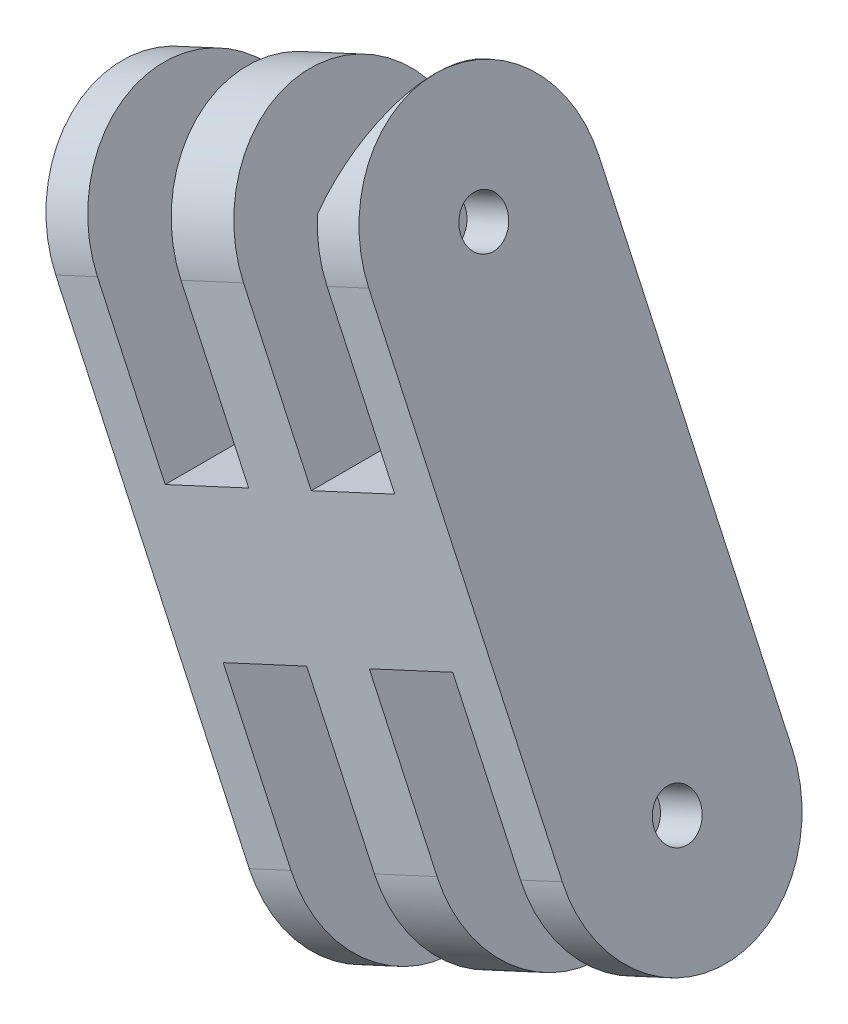
ISO-10303-21;
HEADER;
FILE_DESCRIPTION(('STEP AP214'),'2;1');
FILE_NAME('part.step','',(''),(''),'','','');
FILE_SCHEMA(('AUTOMOTIVE_DESIGN { 1 0 10303 214 1 1 1 1 }'));
ENDSEC;
DATA;
#1=APPLICATION_CONTEXT('core data for automotive mechanical design processes');
#2=APPLICATION_PROTOCOL_DEFINITION('international standard','automotive_design',2000,#1);
#3=PRODUCT_CONTEXT('',#1,'mechanical');
#4=PRODUCT('Part','Part','',(#3));
#5=PRODUCT_RELATED_PRODUCT_CATEGORY('part','',(#4));
#6=PRODUCT_DEFINITION_FORMATION('','',#4);
#7=PRODUCT_DEFINITION_CONTEXT('part definition',#1,'design');
#8=PRODUCT_DEFINITION('design','',#6,#7);
#9=PRODUCT_DEFINITION_SHAPE('','',#8);
#10=(LENGTH_UNIT() NAMED_UNIT(*) SI_UNIT(.MILLI.,.METRE.));
#11=(NAMED_UNIT(*) PLANE_ANGLE_UNIT() SI_UNIT($,.RADIAN.));
#12=(NAMED_UNIT(*) SI_UNIT($,.STERADIAN.) SOLID_ANGLE_UNIT());
#13=UNCERTAINTY_MEASURE_WITH_UNIT(LENGTH_MEASURE(1.E-05),#10,'distance_accuracy_value','');
#14=(GEOMETRIC_REPRESENTATION_CONTEXT(3) GLOBAL_UNCERTAINTY_ASSIGNED_CONTEXT((#13)) GLOBAL_UNIT_ASSIGNED_CONTEXT((#10,
#11,#12)) REPRESENTATION_CONTEXT('',''));
#15=CARTESIAN_POINT('',(0.,0.,0.));
#16=DIRECTION('',(0.,0.,1.));
#17=DIRECTION('',(1.,0.,0.));
#18=AXIS2_PLACEMENT_3D('',#15,#16,#17);
#19=CARTESIAN_POINT('',(-29.7348770197772,-13.7837841719661,10.));
#20=DIRECTION('',(0.907261631256999,0.420566680145836,0.));
#21=DIRECTION('',(-0.420566680145836,0.907261631256999,0.));
#22=AXIS2_PLACEMENT_3D('',#19,#20,#21);
#23=PLANE('',#22);
#24=CARTESIAN_POINT('',(-90.2440618368367,116.748814616222,4.99999999999999));
#25=DIRECTION('',(0.907261631256999,0.420566680145836,0.));
#26=DIRECTION('',(-0.420566680145836,0.907261631256999,0.));
#27=AXIS2_PLACEMENT_3D('',#24,#25,#26);
#28=CIRCLE('',#27,0.999999999999995);
#29=CARTESIAN_POINT('',(-90.6646285169826,117.656076247479,4.99999999999999));
#30=VERTEX_POINT('',#29);
#31=EDGE_CURVE('E465',#30,#30,#28,.T.);
#32=ORIENTED_EDGE('',*,*,#31,.T.);
#33=EDGE_LOOP('',(#32));
#34=FACE_BOUND('',#33,.T.);
#35=CARTESIAN_POINT('',(-90.2440618368367,116.748814616222,4.99999999999999));
#36=DIRECTION('',(0.907261631256999,0.420566680145836,0.));
#37=DIRECTION('',(-0.420566680145836,0.907261631256999,0.));
#38=AXIS2_PLACEMENT_3D('',#35,#36,#37);
#39=CIRCLE('',#38,5.00000000000001);
#40=CARTESIAN_POINT('',(-90.2440618368367,116.748814616222,0.));
#41=VERTEX_POINT('',#40);
#42=CARTESIAN_POINT('',(-90.2440618368367,116.748814616222,10.));
#43=VERTEX_POINT('',#42);
#44=EDGE_CURVE('E243',#41,#43,#39,.F.);
#45=ORIENTED_EDGE('',*,*,#44,.T.);
#46=DIRECTION('',(0.420566680145836,-0.907261631256999,0.));
#47=VECTOR('',#46,1.);
#48=CARTESIAN_POINT('',(-29.7348770197772,-13.7837841719661,10.));
#49=LINE('',#48,#47);
#50=CARTESIAN_POINT('',(-93.1880285978576,123.099646035021,10.));
#51=VERTEX_POINT('',#50);
#52=EDGE_CURVE('E498',#51,#43,#49,.T.);
#53=ORIENTED_EDGE('',*,*,#52,.F.);
#54=DIRECTION('',(0.,0.,-1.));
#55=VECTOR('',#54,1.);
#56=CARTESIAN_POINT('',(-93.1880285978576,123.099646035021,10.));
#57=LINE('',#56,#55);
#58=CARTESIAN_POINT('',(-93.1880285978576,123.099646035021,0.));
#59=VERTEX_POINT('',#58);
#60=EDGE_CURVE('E435',#51,#59,#57,.T.);
#61=ORIENTED_EDGE('',*,*,#60,.T.);
#62=DIRECTION('',(0.420566680145836,-0.907261631256999,0.));
#63=VECTOR('',#62,1.);
#64=CARTESIAN_POINT('',(-29.7348770197772,-13.7837841719661,0.));
#65=LINE('',#64,#63);
#66=EDGE_CURVE('E405',#59,#41,#65,.T.);
#67=ORIENTED_EDGE('',*,*,#66,.T.);
#68=EDGE_LOOP('',(#45,#53,#61,#67));
#69=FACE_BOUND('',#68,.T.);
#70=ADVANCED_FACE('F221',(#34,#69),#23,.F.);
#71=CARTESIAN_POINT('',(-39.7147549636041,-18.4100176535703,10.));
#72=DIRECTION('',(-0.907261631256999,-0.420566680145836,0.));
#73=DIRECTION('',(0.420566680145836,-0.907261631256999,0.));
#74=AXIS2_PLACEMENT_3D('',#71,#72,#73);
#75=PLANE('',#74);
#76=CARTESIAN_POINT('',(-100.223939780664,112.122581134618,4.99999999999999));
#77=DIRECTION('',(-0.907261631256999,-0.420566680145836,0.));
#78=DIRECTION('',(0.420566680145836,-0.907261631256999,0.));
#79=AXIS2_PLACEMENT_3D('',#76,#77,#78);
#80=CIRCLE('',#79,0.999999999999995);
#81=CARTESIAN_POINT('',(-99.8033731005179,111.215319503361,4.99999999999999));
#82=VERTEX_POINT('',#81);
#83=EDGE_CURVE('E482',#82,#82,#80,.T.);
#84=ORIENTED_EDGE('',*,*,#83,.T.);
#85=EDGE_LOOP('',(#84));
#86=FACE_BOUND('',#85,.T.);
#87=DIRECTION('',(-0.420566680145836,0.907261631256999,0.));
#88=VECTOR('',#87,1.);
#89=CARTESIAN_POINT('',(-39.7147549636041,-18.4100176535703,10.));
#90=LINE('',#89,#88);
#91=CARTESIAN_POINT('',(-100.223939780664,112.122581134618,10.));
#92=VERTEX_POINT('',#91);
#93=CARTESIAN_POINT('',(-103.167906541685,118.473412553417,10.));
#94=VERTEX_POINT('',#93);
#95=EDGE_CURVE('E393',#92,#94,#90,.T.);
#96=ORIENTED_EDGE('',*,*,#95,.F.);
#97=CARTESIAN_POINT('',(-100.223939780664,112.122581134618,4.99999999999999));
#98=DIRECTION('',(-0.907261631256999,-0.420566680145836,0.));
#99=DIRECTION('',(0.420566680145836,-0.907261631256999,0.));
#100=AXIS2_PLACEMENT_3D('',#97,#98,#99);
#101=CIRCLE('',#100,5.00000000000001);
#102=CARTESIAN_POINT('',(-100.223939780664,112.122581134618,0.));
#103=VERTEX_POINT('',#102);
#104=EDGE_CURVE('E383',#92,#103,#101,.F.);
#105=ORIENTED_EDGE('',*,*,#104,.T.);
#106=DIRECTION('',(-0.420566680145836,0.907261631256999,0.));
#107=VECTOR('',#106,1.);
#108=CARTESIAN_POINT('',(-39.7147549636041,-18.4100176535703,0.));
#109=LINE('',#108,#107);
#110=CARTESIAN_POINT('',(-103.167906541685,118.473412553417,0.));
#111=VERTEX_POINT('',#110);
#112=EDGE_CURVE('E422',#103,#111,#109,.T.);
#113=ORIENTED_EDGE('',*,*,#112,.T.);
#114=DIRECTION('',(0.,0.,-1.));
#115=VECTOR('',#114,1.);
#116=CARTESIAN_POINT('',(-103.167906541685,118.473412553417,10.));
#117=LINE('',#116,#115);
#118=EDGE_CURVE('E396',#94,#111,#117,.T.);
#119=ORIENTED_EDGE('',*,*,#118,.F.);
#120=EDGE_LOOP('',(#96,#105,#113,#119));
#121=FACE_BOUND('',#120,.T.);
#122=ADVANCED_FACE('F637',(#86,#121),#75,.F.);
#123=CARTESIAN_POINT('',(-96.8170751228855,121.417379314438,10.));
#124=DIRECTION('',(0.907261631256999,0.420566680145836,0.));
#125=DIRECTION('',(-0.420566680145836,0.907261631256999,0.));
#126=AXIS2_PLACEMENT_3D('',#123,#124,#125);
#127=PLANE('',#126);
#128=CARTESIAN_POINT('',(-93.8731083618647,115.066547895639,4.99999999999999));
#129=DIRECTION('',(0.907261631256999,0.420566680145836,0.));
#130=DIRECTION('',(-0.420566680145836,0.907261631256999,0.));
#131=AXIS2_PLACEMENT_3D('',#128,#129,#130);
#132=CIRCLE('',#131,0.999999999999995);
#133=CARTESIAN_POINT('',(-94.2936750420105,115.973809526896,4.99999999999999));
#134=VERTEX_POINT('',#133);
#135=EDGE_CURVE('E478',#134,#134,#132,.T.);
#136=ORIENTED_EDGE('',*,*,#135,.F.);
#137=EDGE_LOOP('',(#136));
#138=FACE_BOUND('',#137,.T.);
#139=DIRECTION('',(0.420566680145836,-0.907261631256999,0.));
#140=VECTOR('',#139,1.);
#141=CARTESIAN_POINT('',(-96.8170751228855,121.417379314438,10.));
#142=LINE('',#141,#140);
#143=CARTESIAN_POINT('',(-96.8170751228856,121.417379314438,10.));
#144=VERTEX_POINT('',#143);
#145=CARTESIAN_POINT('',(-93.8731083618647,115.066547895639,10.));
#146=VERTEX_POINT('',#145);
#147=EDGE_CURVE('E456',#144,#146,#142,.T.);
#148=ORIENTED_EDGE('',*,*,#147,.T.);
#149=CARTESIAN_POINT('',(-93.8731083618647,115.066547895639,4.99999999999999));
#150=DIRECTION('',(0.907261631256999,0.420566680145836,0.));
#151=DIRECTION('',(-0.420566680145836,0.907261631256999,0.));
#152=AXIS2_PLACEMENT_3D('',#149,#150,#151);
#153=CIRCLE('',#152,5.00000000000001);
#154=CARTESIAN_POINT('',(-93.8731083618647,115.066547895639,0.));
#155=VERTEX_POINT('',#154);
#156=EDGE_CURVE('E487',#155,#146,#153,.F.);
#157=ORIENTED_EDGE('',*,*,#156,.F.);
#158=DIRECTION('',(0.420566680145836,-0.907261631256999,0.));
#159=VECTOR('',#158,1.);
#160=CARTESIAN_POINT('',(-96.8170751228855,121.417379314438,0.));
#161=LINE('',#160,#159);
#162=CARTESIAN_POINT('',(-96.8170751228856,121.417379314438,0.));
#163=VERTEX_POINT('',#162);
#164=EDGE_CURVE('E462',#163,#155,#161,.T.);
#165=ORIENTED_EDGE('',*,*,#164,.F.);
#166=DIRECTION('',(0.,0.,-1.));
#167=VECTOR('',#166,1.);
#168=CARTESIAN_POINT('',(-96.8170751228855,121.417379314438,10.));
#169=LINE('',#168,#167);
#170=EDGE_CURVE('E446',#144,#163,#169,.T.);
#171=ORIENTED_EDGE('',*,*,#170,.F.);
#172=EDGE_LOOP('',(#148,#157,#165,#171));
#173=FACE_BOUND('',#172,.T.);
#174=ADVANCED_FACE('F223',(#138,#173),#127,.T.);
#175=CARTESIAN_POINT('',(-99.5388600166565,120.155679274,10.));
#176=DIRECTION('',(0.907261631256999,0.420566680145835,0.));
#177=DIRECTION('',(-0.420566680145835,0.907261631256999,0.));
#178=AXIS2_PLACEMENT_3D('',#175,#176,#177);
#179=PLANE('',#178);
#180=CARTESIAN_POINT('',(-96.5948932556357,113.804847855201,4.99999999999999));
#181=DIRECTION('',(0.907261631256999,0.420566680145835,0.));
#182=DIRECTION('',(-0.420566680145835,0.907261631256999,0.));
#183=AXIS2_PLACEMENT_3D('',#180,#181,#182);
#184=CIRCLE('',#183,0.999999999999995);
#185=CARTESIAN_POINT('',(-97.0154599357816,114.712109486458,4.99999999999999));
#186=VERTEX_POINT('',#185);
#187=EDGE_CURVE('E476',#186,#186,#184,.T.);
#188=ORIENTED_EDGE('',*,*,#187,.T.);
#189=EDGE_LOOP('',(#188));
#190=FACE_BOUND('',#189,.T.);
#191=CARTESIAN_POINT('',(-96.5948932556357,113.804847855201,4.99999999999999));
#192=DIRECTION('',(0.907261631256999,0.420566680145835,0.));
#193=DIRECTION('',(-0.420566680145835,0.907261631256999,0.));
#194=AXIS2_PLACEMENT_3D('',#191,#192,#193);
#195=CIRCLE('',#194,5.00000000000001);
#196=CARTESIAN_POINT('',(-96.5948932556357,113.804847855201,0.));
#197=VERTEX_POINT('',#196);
#198=CARTESIAN_POINT('',(-96.5948932556357,113.804847855201,10.));
#199=VERTEX_POINT('',#198);
#200=EDGE_CURVE('E571',#197,#199,#195,.F.);
#201=ORIENTED_EDGE('',*,*,#200,.T.);
#202=DIRECTION('',(0.420566680145835,-0.907261631256999,0.));
#203=VECTOR('',#202,1.);
#204=CARTESIAN_POINT('',(-99.5388600166565,120.155679274,10.));
#205=LINE('',#204,#203);
#206=CARTESIAN_POINT('',(-99.5388600166565,120.155679274,10.));
#207=VERTEX_POINT('',#206);
#208=EDGE_CURVE('E454',#207,#199,#205,.T.);
#209=ORIENTED_EDGE('',*,*,#208,.F.);
#210=DIRECTION('',(0.,0.,-1.));
#211=VECTOR('',#210,1.);
#212=CARTESIAN_POINT('',(-99.5388600166565,120.155679274,10.));
#213=LINE('',#212,#211);
#214=CARTESIAN_POINT('',(-99.5388600166565,120.155679274,0.));
#215=VERTEX_POINT('',#214);
#216=EDGE_CURVE('E444',#207,#215,#213,.T.);
#217=ORIENTED_EDGE('',*,*,#216,.T.);
#218=DIRECTION('',(0.420566680145835,-0.907261631256999,0.));
#219=VECTOR('',#218,1.);
#220=CARTESIAN_POINT('',(-99.5388600166565,120.155679274,0.));
#221=LINE('',#220,#219);
#222=EDGE_CURVE('E459',#215,#197,#221,.T.);
#223=ORIENTED_EDGE('',*,*,#222,.T.);
#224=EDGE_LOOP('',(#201,#209,#217,#223));
#225=FACE_BOUND('',#224,.T.);
#226=ADVANCED_FACE('F669',(#190,#225),#179,.F.);
#227=CARTESIAN_POINT('',(-27.9203537572632,-12.9426508116745,10.));
#228=DIRECTION('',(0.907261631256999,0.420566680145836,0.));
#229=DIRECTION('',(-0.420566680145836,0.907261631256999,0.));
#230=AXIS2_PLACEMENT_3D('',#227,#228,#229);
#231=PLANE('',#230);
#232=CARTESIAN_POINT('',(-88.4295385743227,117.589947976514,4.99999999999999));
#233=DIRECTION('',(0.907261631256999,0.420566680145836,0.));
#234=DIRECTION('',(-0.420566680145836,0.907261631256999,0.));
#235=AXIS2_PLACEMENT_3D('',#232,#233,#234);
#236=CIRCLE('',#235,0.999999999999995);
#237=CARTESIAN_POINT('',(-88.8501052544685,118.497209607771,4.99999999999999));
#238=VERTEX_POINT('',#237);
#239=EDGE_CURVE('E598',#238,#238,#236,.T.);
#240=ORIENTED_EDGE('',*,*,#239,.F.);
#241=EDGE_LOOP('',(#240));
#242=FACE_BOUND('',#241,.T.);
#243=CARTESIAN_POINT('',(-96.8408721772394,135.735180601654,5.));
#244=DIRECTION('',(0.907261631256999,0.420566680145836,0.));
#245=DIRECTION('',(-0.420566680145836,0.907261631256999,0.));
#246=AXIS2_PLACEMENT_3D('',#243,#244,#245);
#247=CIRCLE('',#246,1.);
#248=CARTESIAN_POINT('',(-97.2614388573853,136.642442232911,5.));
#249=VERTEX_POINT('',#248);
#250=EDGE_CURVE('E605',#249,#249,#247,.T.);
#251=ORIENTED_EDGE('',*,*,#250,.F.);
#252=EDGE_LOOP('',(#251));
#253=FACE_BOUND('',#252,.T.);
#254=DIRECTION('',(0.420566680145836,-0.907261631256999,0.));
#255=VECTOR('',#254,1.);
#256=CARTESIAN_POINT('',(-27.9203537572632,-12.9426508116745,10.));
#257=LINE('',#256,#255);
#258=CARTESIAN_POINT('',(-96.8408721772394,135.735180601654,10.));
#259=VERTEX_POINT('',#258);
#260=CARTESIAN_POINT('',(-88.4295385743227,117.589947976514,10.));
#261=VERTEX_POINT('',#260);
#262=EDGE_CURVE('E501',#259,#261,#257,.T.);
#263=ORIENTED_EDGE('',*,*,#262,.T.);
#264=CARTESIAN_POINT('',(-88.4295385743227,117.589947976514,4.99999999999999));
#265=DIRECTION('',(0.907261631256999,0.420566680145836,0.));
#266=DIRECTION('',(-0.420566680145836,0.907261631256999,0.));
#267=AXIS2_PLACEMENT_3D('',#264,#265,#266);
#268=CIRCLE('',#267,5.00000000000001);
#269=CARTESIAN_POINT('',(-88.4295385743227,117.589947976514,0.));
#270=VERTEX_POINT('',#269);
#271=EDGE_CURVE('E377',#270,#261,#268,.F.);
#272=ORIENTED_EDGE('',*,*,#271,.F.);
#273=DIRECTION('',(0.420566680145836,-0.907261631256999,0.));
#274=VECTOR('',#273,1.);
#275=CARTESIAN_POINT('',(-27.9203537572632,-12.9426508116745,0.));
#276=LINE('',#275,#274);
#277=CARTESIAN_POINT('',(-96.8408721772394,135.735180601654,0.));
#278=VERTEX_POINT('',#277);
#279=EDGE_CURVE('E409',#278,#270,#276,.T.);
#280=ORIENTED_EDGE('',*,*,#279,.F.);
#281=CARTESIAN_POINT('',(-96.8408721772394,135.735180601654,5.));
#282=DIRECTION('',(0.907261631256999,0.420566680145836,0.));
#283=DIRECTION('',(-0.420566680145836,0.907261631256999,0.));
#284=AXIS2_PLACEMENT_3D('',#281,#282,#283);
#285=CIRCLE('',#284,5.);
#286=CARTESIAN_POINT('',(-98.9437055779686,140.271488757939,5.));
#287=VERTEX_POINT('',#286);
#288=EDGE_CURVE('E556',#287,#278,#285,.F.);
#289=ORIENTED_EDGE('',*,*,#288,.F.);
#290=CARTESIAN_POINT('',(-96.8408721772394,135.735180601654,5.));
#291=DIRECTION('',(0.907261631256999,0.420566680145836,0.));
#292=DIRECTION('',(-0.420566680145836,0.907261631256999,0.));
#293=AXIS2_PLACEMENT_3D('',#290,#291,#292);
#294=CIRCLE('',#293,5.);
#295=EDGE_CURVE('E527',#259,#287,#294,.F.);
#296=ORIENTED_EDGE('',*,*,#295,.F.);
#297=EDGE_LOOP('',(#263,#272,#280,#289,#296));
#298=FACE_BOUND('',#297,.T.);
#299=ADVANCED_FACE('F646',(#242,#253,#298),#231,.T.);
#300=CARTESIAN_POINT('',(-29.7348770197773,-13.7837841719662,10.));
#301=DIRECTION('',(-0.907261631256999,-0.420566680145835,0.));
#302=DIRECTION('',(0.420566680145835,-0.907261631256999,0.));
#303=AXIS2_PLACEMENT_3D('',#300,#301,#302);
#304=PLANE('',#303);
#305=CARTESIAN_POINT('',(-98.6553954397534,134.894047241362,5.));
#306=DIRECTION('',(-0.907261631256999,-0.420566680145835,0.));
#307=DIRECTION('',(0.420566680145835,-0.907261631256999,0.));
#308=AXIS2_PLACEMENT_3D('',#305,#306,#307);
#309=CIRCLE('',#308,1.);
#310=CARTESIAN_POINT('',(-98.2348287596076,133.986785610105,5.));
#311=VERTEX_POINT('',#310);
#312=EDGE_CURVE('E612',#311,#311,#309,.T.);
#313=ORIENTED_EDGE('',*,*,#312,.F.);
#314=EDGE_LOOP('',(#313));
#315=FACE_BOUND('',#314,.T.);
#316=CARTESIAN_POINT('',(-98.6553954397534,134.894047241362,5.));
#317=DIRECTION('',(-0.907261631256999,-0.420566680145835,0.));
#318=DIRECTION('',(0.420566680145835,-0.907261631256999,0.));
#319=AXIS2_PLACEMENT_3D('',#316,#317,#318);
#320=CIRCLE('',#319,5.);
#321=CARTESIAN_POINT('',(-99.586991765135,136.903720479255,9.48255973339234));
#322=VERTEX_POINT('',#321);
#323=CARTESIAN_POINT('',(-98.6553954397534,134.894047241362,10.));
#324=VERTEX_POINT('',#323);
#325=EDGE_CURVE('E236',#322,#324,#320,.F.);
#326=ORIENTED_EDGE('',*,*,#325,.F.);
#327=DIRECTION('',(0.,0.,-1.));
#328=VECTOR('',#327,1.);
#329=CARTESIAN_POINT('',(-99.586991765135,136.903720479255,10.));
#330=LINE('',#329,#328);
#331=CARTESIAN_POINT('',(-99.586991765135,136.903720479255,0.517440266607655));
#332=VERTEX_POINT('',#331);
#333=EDGE_CURVE('E433',#322,#332,#330,.T.);
#334=ORIENTED_EDGE('',*,*,#333,.T.);
#335=CARTESIAN_POINT('',(-98.6553954397534,134.894047241362,5.));
#336=DIRECTION('',(-0.907261631256999,-0.420566680145835,0.));
#337=DIRECTION('',(0.420566680145835,-0.907261631256999,0.));
#338=AXIS2_PLACEMENT_3D('',#335,#336,#337);
#339=CIRCLE('',#338,5.);
#340=CARTESIAN_POINT('',(-98.6553954397534,134.894047241362,0.));
#341=VERTEX_POINT('',#340);
#342=EDGE_CURVE('E572',#341,#332,#339,.F.);
#343=ORIENTED_EDGE('',*,*,#342,.F.);
#344=DIRECTION('',(-0.420566680145835,0.907261631256999,0.));
#345=VECTOR('',#344,1.);
#346=CARTESIAN_POINT('',(-29.7348770197773,-13.7837841719662,0.));
#347=LINE('',#346,#345);
#348=CARTESIAN_POINT('',(-95.7114286787326,128.543215822563,0.));
#349=VERTEX_POINT('',#348);
#350=EDGE_CURVE('E412',#349,#341,#347,.T.);
#351=ORIENTED_EDGE('',*,*,#350,.F.);
#352=DIRECTION('',(0.,0.,-1.));
#353=VECTOR('',#352,1.);
#354=CARTESIAN_POINT('',(-95.7114286787326,128.543215822563,10.));
#355=LINE('',#354,#353);
#356=CARTESIAN_POINT('',(-95.7114286787326,128.543215822563,10.));
#357=VERTEX_POINT('',#356);
#358=EDGE_CURVE('E430',#357,#349,#355,.T.);
#359=ORIENTED_EDGE('',*,*,#358,.F.);
#360=DIRECTION('',(-0.420566680145835,0.907261631256999,0.));
#361=VECTOR('',#360,1.);
#362=CARTESIAN_POINT('',(-29.7348770197773,-13.7837841719662,10.));
#363=LINE('',#362,#361);
#364=EDGE_CURVE('E504',#357,#324,#363,.T.);
#365=ORIENTED_EDGE('',*,*,#364,.T.);
#366=EDGE_LOOP('',(#326,#334,#343,#351,#359,#365));
#367=FACE_BOUND('',#366,.T.);
#368=ADVANCED_FACE('F521',(#315,#367),#304,.T.);
#369=CARTESIAN_POINT('',(-39.7147549636038,-18.4100176535703,10.));
#370=DIRECTION('',(0.907261631256998,0.420566680145837,0.));
#371=DIRECTION('',(-0.420566680145837,0.907261631256998,0.));
#372=AXIS2_PLACEMENT_3D('',#369,#370,#371);
#373=PLANE('',#372);
#374=CARTESIAN_POINT('',(-108.63527338358,130.267813759758,5.));
#375=DIRECTION('',(0.907261631256998,0.420566680145837,0.));
#376=DIRECTION('',(-0.420566680145837,0.907261631256998,0.));
#377=AXIS2_PLACEMENT_3D('',#374,#375,#376);
#378=CIRCLE('',#377,1.);
#379=CARTESIAN_POINT('',(-109.055840063726,131.175075391015,5.));
#380=VERTEX_POINT('',#379);
#381=EDGE_CURVE('E609',#380,#380,#378,.T.);
#382=ORIENTED_EDGE('',*,*,#381,.F.);
#383=EDGE_LOOP('',(#382));
#384=FACE_BOUND('',#383,.T.);
#385=CARTESIAN_POINT('',(-108.63527338358,130.267813759758,5.));
#386=DIRECTION('',(0.907261631256998,0.420566680145837,0.));
#387=DIRECTION('',(-0.420566680145837,0.907261631256998,0.));
#388=AXIS2_PLACEMENT_3D('',#385,#386,#387);
#389=CIRCLE('',#388,5.);
#390=CARTESIAN_POINT('',(-108.63527338358,130.267813759758,10.));
#391=VERTEX_POINT('',#390);
#392=CARTESIAN_POINT('',(-108.63527338358,130.267813759758,0.));
#393=VERTEX_POINT('',#392);
#394=EDGE_CURVE('E534',#391,#393,#389,.F.);
#395=ORIENTED_EDGE('',*,*,#394,.F.);
#396=DIRECTION('',(0.420566680145837,-0.907261631256998,0.));
#397=VECTOR('',#396,1.);
#398=CARTESIAN_POINT('',(-39.7147549636038,-18.4100176535703,10.));
#399=LINE('',#398,#397);
#400=CARTESIAN_POINT('',(-105.69130662256,123.916982340959,10.));
#401=VERTEX_POINT('',#400);
#402=EDGE_CURVE('E394',#391,#401,#399,.T.);
#403=ORIENTED_EDGE('',*,*,#402,.T.);
#404=DIRECTION('',(0.,0.,-1.));
#405=VECTOR('',#404,1.);
#406=CARTESIAN_POINT('',(-105.69130662256,123.916982340959,10.));
#407=LINE('',#406,#405);
#408=CARTESIAN_POINT('',(-105.69130662256,123.916982340959,0.));
#409=VERTEX_POINT('',#408);
#410=EDGE_CURVE('E427',#401,#409,#407,.T.);
#411=ORIENTED_EDGE('',*,*,#410,.T.);
#412=DIRECTION('',(0.420566680145837,-0.907261631256998,0.));
#413=VECTOR('',#412,1.);
#414=CARTESIAN_POINT('',(-39.7147549636038,-18.4100176535703,0.));
#415=LINE('',#414,#413);
#416=EDGE_CURVE('E419',#393,#409,#415,.T.);
#417=ORIENTED_EDGE('',*,*,#416,.F.);
#418=EDGE_LOOP('',(#395,#403,#411,#417));
#419=FACE_BOUND('',#418,.T.);
#420=ADVANCED_FACE('F538',(#384,#419),#373,.T.);
#421=CARTESIAN_POINT('',(-41.5292782261182,-19.251151013862,10.));
#422=DIRECTION('',(0.907261631256999,0.420566680145836,0.));
#423=DIRECTION('',(-0.420566680145836,0.907261631256999,0.));
#424=AXIS2_PLACEMENT_3D('',#421,#422,#423);
#425=PLANE('',#424);
#426=CARTESIAN_POINT('',(-102.038463043178,111.281447774326,4.99999999999999));
#427=DIRECTION('',(0.907261631256999,0.420566680145836,0.));
#428=DIRECTION('',(-0.420566680145836,0.907261631256999,0.));
#429=AXIS2_PLACEMENT_3D('',#426,#427,#428);
#430=CIRCLE('',#429,0.999999999999995);
#431=CARTESIAN_POINT('',(-102.459029723324,112.188709405583,4.99999999999999));
#432=VERTEX_POINT('',#431);
#433=EDGE_CURVE('E600',#432,#432,#430,.T.);
#434=ORIENTED_EDGE('',*,*,#433,.T.);
#435=EDGE_LOOP('',(#434));
#436=FACE_BOUND('',#435,.T.);
#437=CARTESIAN_POINT('',(-110.449796646094,129.426680399466,5.));
#438=DIRECTION('',(0.907261631256999,0.420566680145836,0.));
#439=DIRECTION('',(-0.420566680145836,0.907261631256999,0.));
#440=AXIS2_PLACEMENT_3D('',#437,#438,#439);
#441=CIRCLE('',#440,1.);
#442=CARTESIAN_POINT('',(-110.87036332624,130.333942030723,5.));
#443=VERTEX_POINT('',#442);
#444=EDGE_CURVE('E474',#443,#443,#441,.T.);
#445=ORIENTED_EDGE('',*,*,#444,.T.);
#446=EDGE_LOOP('',(#445));
#447=FACE_BOUND('',#446,.T.);
#448=CARTESIAN_POINT('',(-102.038463043178,111.281447774326,4.99999999999999));
#449=DIRECTION('',(0.907261631256999,0.420566680145836,0.));
#450=DIRECTION('',(-0.420566680145836,0.907261631256999,0.));
#451=AXIS2_PLACEMENT_3D('',#448,#449,#450);
#452=CIRCLE('',#451,5.00000000000001);
#453=CARTESIAN_POINT('',(-102.038463043178,111.281447774326,0.));
#454=VERTEX_POINT('',#453);
#455=CARTESIAN_POINT('',(-102.038463043178,111.281447774326,10.));
#456=VERTEX_POINT('',#455);
#457=EDGE_CURVE('E366',#454,#456,#452,.F.);
#458=ORIENTED_EDGE('',*,*,#457,.T.);
#459=DIRECTION('',(0.420566680145836,-0.907261631256999,0.));
#460=VECTOR('',#459,1.);
#461=CARTESIAN_POINT('',(-41.5292782261182,-19.251151013862,10.));
#462=LINE('',#461,#460);
#463=CARTESIAN_POINT('',(-110.449796646094,129.426680399466,10.));
#464=VERTEX_POINT('',#463);
#465=EDGE_CURVE('E371',#464,#456,#462,.T.);
#466=ORIENTED_EDGE('',*,*,#465,.F.);
#467=CARTESIAN_POINT('',(-110.449796646094,129.426680399466,5.));
#468=DIRECTION('',(0.907261631256999,0.420566680145836,0.));
#469=DIRECTION('',(-0.420566680145836,0.907261631256999,0.));
#470=AXIS2_PLACEMENT_3D('',#467,#468,#469);
#471=CIRCLE('',#470,5.);
#472=CARTESIAN_POINT('',(-110.449796646094,129.426680399466,0.));
#473=VERTEX_POINT('',#472);
#474=EDGE_CURVE('E536',#464,#473,#471,.F.);
#475=ORIENTED_EDGE('',*,*,#474,.T.);
#476=DIRECTION('',(0.420566680145836,-0.907261631256999,0.));
#477=VECTOR('',#476,1.);
#478=CARTESIAN_POINT('',(-41.5292782261182,-19.251151013862,0.));
#479=LINE('',#478,#477);
#480=EDGE_CURVE('E373',#473,#454,#479,.T.);
#481=ORIENTED_EDGE('',*,*,#480,.T.);
#482=EDGE_LOOP('',(#458,#466,#475,#481));
#483=FACE_BOUND('',#482,.T.);
#484=ADVANCED_FACE('F368',(#436,#447,#483),#425,.F.);
#485=CARTESIAN_POINT('',(0.,0.,10.));
#486=DIRECTION('',(0.,0.,1.));
#487=DIRECTION('',(1.,0.,0.));
#488=AXIS2_PLACEMENT_3D('',#485,#486,#487);
#489=PLANE('',#488);
#490=DIRECTION('',(0.907261631256999,0.420566680145836,0.));
#491=VECTOR('',#490,1.);
#492=CARTESIAN_POINT('',(-102.038463043178,111.281447774326,10.));
#493=LINE('',#492,#491);
#494=EDGE_CURVE('E12',#261,#43,#493,.F.);
#495=ORIENTED_EDGE('',*,*,#494,.F.);
#496=ORIENTED_EDGE('',*,*,#262,.F.);
#497=DIRECTION('',(0.907261631256999,0.420566680145836,0.));
#498=VECTOR('',#497,1.);
#499=CARTESIAN_POINT('',(-110.449796646094,129.426680399466,10.));
#500=LINE('',#499,#498);
#501=EDGE_CURVE('E524',#324,#259,#500,.T.);
#502=ORIENTED_EDGE('',*,*,#501,.F.);
#503=ORIENTED_EDGE('',*,*,#364,.F.);
#504=DIRECTION('',(0.907261631257,0.420566680145833,0.));
#505=VECTOR('',#504,1.);
#506=CARTESIAN_POINT('',(-65.976551658955,142.326999994529,10.));
#507=LINE('',#506,#505);
#508=CARTESIAN_POINT('',(-99.3404752037606,126.86094910198,10.));
#509=VERTEX_POINT('',#508);
#510=EDGE_CURVE('E506',#509,#357,#507,.T.);
#511=ORIENTED_EDGE('',*,*,#510,.F.);
#512=DIRECTION('',(0.420566680145835,-0.907261631256999,0.));
#513=VECTOR('',#512,1.);
#514=CARTESIAN_POINT('',(-104.387275365511,137.748088677064,10.));
#515=LINE('',#514,#513);
#516=CARTESIAN_POINT('',(-102.284441964781,133.211780520779,10.));
#517=VERTEX_POINT('',#516);
#518=EDGE_CURVE('E447',#517,#509,#515,.T.);
#519=ORIENTED_EDGE('',*,*,#518,.F.);
#520=CARTESIAN_POINT('',(-105.006226858552,131.950080480341,10.));
#521=VERTEX_POINT('',#520);
#522=EDGE_CURVE('E526',#521,#517,#500,.T.);
#523=ORIENTED_EDGE('',*,*,#522,.F.);
#524=DIRECTION('',(0.420566680145836,-0.907261631256999,0.));
#525=VECTOR('',#524,1.);
#526=CARTESIAN_POINT('',(-107.109060259282,136.486388636626,10.));
#527=LINE('',#526,#525);
#528=CARTESIAN_POINT('',(-102.062260097532,125.599249061542,10.));
#529=VERTEX_POINT('',#528);
#530=EDGE_CURVE('E449',#521,#529,#527,.T.);
#531=ORIENTED_EDGE('',*,*,#530,.T.);
#532=EDGE_CURVE('E398',#401,#529,#507,.T.);
#533=ORIENTED_EDGE('',*,*,#532,.F.);
#534=ORIENTED_EDGE('',*,*,#402,.F.);
#535=EDGE_CURVE('E386',#464,#391,#500,.T.);
#536=ORIENTED_EDGE('',*,*,#535,.F.);
#537=ORIENTED_EDGE('',*,*,#465,.T.);
#538=DIRECTION('',(0.907261631256999,0.420566680145836,0.));
#539=VECTOR('',#538,1.);
#540=CARTESIAN_POINT('',(-102.038463043178,111.281447774326,10.));
#541=LINE('',#540,#539);
#542=EDGE_CURVE('E380',#456,#92,#541,.T.);
#543=ORIENTED_EDGE('',*,*,#542,.T.);
#544=ORIENTED_EDGE('',*,*,#95,.T.);
#545=DIRECTION('',(0.907261631256998,0.420566680145836,0.));
#546=VECTOR('',#545,1.);
#547=CARTESIAN_POINT('',(-63.4531515780805,136.883430206987,10.));
#548=LINE('',#547,#546);
#549=EDGE_CURVE('E495',#94,#207,#548,.T.);
#550=ORIENTED_EDGE('',*,*,#549,.T.);
#551=ORIENTED_EDGE('',*,*,#208,.T.);
#552=EDGE_CURVE('E229',#146,#199,#493,.F.);
#553=ORIENTED_EDGE('',*,*,#552,.F.);
#554=ORIENTED_EDGE('',*,*,#147,.F.);
#555=EDGE_CURVE('E424',#144,#51,#548,.T.);
#556=ORIENTED_EDGE('',*,*,#555,.T.);
#557=ORIENTED_EDGE('',*,*,#52,.T.);
#558=EDGE_LOOP('',(#495,#496,#502,#503,#511,#519,#523,#531,#533,#534,#536,#537,#543,#544,#550,
#551,#553,#554,#556,#557));
#559=FACE_BOUND('',#558,.T.);
#560=ADVANCED_FACE('F390',(#559),#489,.T.);
#561=CARTESIAN_POINT('',(-104.387275365511,137.748088677064,10.));
#562=DIRECTION('',(0.907261631256999,0.420566680145835,0.));
#563=DIRECTION('',(-0.420566680145835,0.907261631256999,0.));
#564=AXIS2_PLACEMENT_3D('',#561,#562,#563);
#565=PLANE('',#564);
#566=CARTESIAN_POINT('',(-102.284441964781,133.211780520779,5.));
#567=DIRECTION('',(0.907261631256999,0.420566680145835,0.));
#568=DIRECTION('',(-0.420566680145835,0.907261631256999,0.));
#569=AXIS2_PLACEMENT_3D('',#566,#567,#568);
#570=CIRCLE('',#569,1.);
#571=CARTESIAN_POINT('',(-102.705008644927,134.119042152036,5.));
#572=VERTEX_POINT('',#571);
#573=EDGE_CURVE('E473',#572,#572,#570,.T.);
#574=ORIENTED_EDGE('',*,*,#573,.F.);
#575=EDGE_LOOP('',(#574));
#576=FACE_BOUND('',#575,.T.);
#577=CARTESIAN_POINT('',(-102.284441964781,133.211780520779,5.));
#578=DIRECTION('',(0.907261631256999,0.420566680145835,0.));
#579=DIRECTION('',(-0.420566680145835,0.907261631256999,0.));
#580=AXIS2_PLACEMENT_3D('',#577,#578,#579);
#581=CIRCLE('',#580,5.);
#582=CARTESIAN_POINT('',(-102.284441964781,133.211780520779,0.));
#583=VERTEX_POINT('',#582);
#584=EDGE_CURVE('E615',#517,#583,#581,.F.);
#585=ORIENTED_EDGE('',*,*,#584,.F.);
#586=ORIENTED_EDGE('',*,*,#518,.T.);
#587=DIRECTION('',(0.,0.,-1.));
#588=VECTOR('',#587,1.);
#589=CARTESIAN_POINT('',(-99.3404752037606,126.86094910198,10.));
#590=LINE('',#589,#588);
#591=CARTESIAN_POINT('',(-99.3404752037606,126.86094910198,0.));
#592=VERTEX_POINT('',#591);
#593=EDGE_CURVE('E441',#509,#592,#590,.T.);
#594=ORIENTED_EDGE('',*,*,#593,.T.);
#595=DIRECTION('',(0.420566680145835,-0.907261631256999,0.));
#596=VECTOR('',#595,1.);
#597=CARTESIAN_POINT('',(-104.387275365511,137.748088677064,0.));
#598=LINE('',#597,#596);
#599=EDGE_CURVE('E452',#583,#592,#598,.T.);
#600=ORIENTED_EDGE('',*,*,#599,.F.);
#601=EDGE_LOOP('',(#585,#586,#594,#600));
#602=FACE_BOUND('',#601,.T.);
#603=ADVANCED_FACE('F621',(#576,#602),#565,.T.);
#604=CARTESIAN_POINT('',(-107.109060259282,136.486388636626,10.));
#605=DIRECTION('',(0.907261631256999,0.420566680145836,0.));
#606=DIRECTION('',(-0.420566680145836,0.907261631256999,0.));
#607=AXIS2_PLACEMENT_3D('',#604,#605,#606);
#608=PLANE('',#607);
#609=CARTESIAN_POINT('',(-105.006226858552,131.950080480341,5.));
#610=DIRECTION('',(0.907261631256999,0.420566680145836,0.));
#611=DIRECTION('',(-0.420566680145836,0.907261631256999,0.));
#612=AXIS2_PLACEMENT_3D('',#609,#610,#611);
#613=CIRCLE('',#612,1.);
#614=CARTESIAN_POINT('',(-105.426793538698,132.857342111598,5.));
#615=VERTEX_POINT('',#614);
#616=EDGE_CURVE('E470',#615,#615,#613,.T.);
#617=ORIENTED_EDGE('',*,*,#616,.T.);
#618=EDGE_LOOP('',(#617));
#619=FACE_BOUND('',#618,.T.);
#620=ORIENTED_EDGE('',*,*,#530,.F.);
#621=CARTESIAN_POINT('',(-105.006226858552,131.950080480341,5.));
#622=DIRECTION('',(0.907261631256999,0.420566680145836,0.));
#623=DIRECTION('',(-0.420566680145836,0.907261631256999,0.));
#624=AXIS2_PLACEMENT_3D('',#621,#622,#623);
#625=CIRCLE('',#624,5.);
#626=CARTESIAN_POINT('',(-105.006226858552,131.950080480341,0.));
#627=VERTEX_POINT('',#626);
#628=EDGE_CURVE('E469',#521,#627,#625,.F.);
#629=ORIENTED_EDGE('',*,*,#628,.T.);
#630=DIRECTION('',(0.420566680145836,-0.907261631256999,0.));
#631=VECTOR('',#630,1.);
#632=CARTESIAN_POINT('',(-107.109060259282,136.486388636626,0.));
#633=LINE('',#632,#631);
#634=CARTESIAN_POINT('',(-102.062260097532,125.599249061542,0.));
#635=VERTEX_POINT('',#634);
#636=EDGE_CURVE('E450',#627,#635,#633,.T.);
#637=ORIENTED_EDGE('',*,*,#636,.T.);
#638=DIRECTION('',(0.,0.,-1.));
#639=VECTOR('',#638,1.);
#640=CARTESIAN_POINT('',(-102.062260097532,125.599249061542,10.));
#641=LINE('',#640,#639);
#642=EDGE_CURVE('E438',#529,#635,#641,.T.);
#643=ORIENTED_EDGE('',*,*,#642,.F.);
#644=EDGE_LOOP('',(#620,#629,#637,#643));
#645=FACE_BOUND('',#644,.T.);
#646=ADVANCED_FACE('F624',(#619,#645),#608,.F.);
#647=CARTESIAN_POINT('',(0.,0.,0.));
#648=DIRECTION('',(0.,0.,1.));
#649=DIRECTION('',(1.,0.,0.));
#650=AXIS2_PLACEMENT_3D('',#647,#648,#649);
#651=PLANE('',#650);
#652=DIRECTION('',(0.907261631256999,0.420566680145836,0.));
#653=VECTOR('',#652,1.);
#654=CARTESIAN_POINT('',(-110.449796646094,129.426680399466,0.));
#655=LINE('',#654,#653);
#656=EDGE_CURVE('E551',#341,#278,#655,.T.);
#657=ORIENTED_EDGE('',*,*,#656,.T.);
#658=ORIENTED_EDGE('',*,*,#279,.T.);
#659=DIRECTION('',(0.907261631256999,0.420566680145836,0.));
#660=VECTOR('',#659,1.);
#661=CARTESIAN_POINT('',(-102.038463043178,111.281447774326,0.));
#662=LINE('',#661,#660);
#663=EDGE_CURVE('E376',#41,#270,#662,.T.);
#664=ORIENTED_EDGE('',*,*,#663,.F.);
#665=ORIENTED_EDGE('',*,*,#66,.F.);
#666=DIRECTION('',(0.907261631256998,0.420566680145836,0.));
#667=VECTOR('',#666,1.);
#668=CARTESIAN_POINT('',(-63.4531515780805,136.883430206987,0.));
#669=LINE('',#668,#667);
#670=EDGE_CURVE('E406',#163,#59,#669,.T.);
#671=ORIENTED_EDGE('',*,*,#670,.F.);
#672=ORIENTED_EDGE('',*,*,#164,.T.);
#673=EDGE_CURVE('E583',#197,#155,#662,.T.);
#674=ORIENTED_EDGE('',*,*,#673,.F.);
#675=ORIENTED_EDGE('',*,*,#222,.F.);
#676=EDGE_CURVE('E402',#111,#215,#669,.T.);
#677=ORIENTED_EDGE('',*,*,#676,.F.);
#678=ORIENTED_EDGE('',*,*,#112,.F.);
#679=EDGE_CURVE('E596',#454,#103,#662,.T.);
#680=ORIENTED_EDGE('',*,*,#679,.F.);
#681=ORIENTED_EDGE('',*,*,#480,.F.);
#682=EDGE_CURVE('E548',#473,#393,#655,.T.);
#683=ORIENTED_EDGE('',*,*,#682,.T.);
#684=ORIENTED_EDGE('',*,*,#416,.T.);
#685=DIRECTION('',(0.907261631257,0.420566680145833,0.));
#686=VECTOR('',#685,1.);
#687=CARTESIAN_POINT('',(-65.976551658955,142.326999994529,0.));
#688=LINE('',#687,#686);
#689=EDGE_CURVE('E416',#409,#635,#688,.T.);
#690=ORIENTED_EDGE('',*,*,#689,.T.);
#691=ORIENTED_EDGE('',*,*,#636,.F.);
#692=EDGE_CURVE('E549',#627,#583,#655,.T.);
#693=ORIENTED_EDGE('',*,*,#692,.T.);
#694=ORIENTED_EDGE('',*,*,#599,.T.);
#695=EDGE_CURVE('E415',#592,#349,#688,.T.);
#696=ORIENTED_EDGE('',*,*,#695,.T.);
#697=ORIENTED_EDGE('',*,*,#350,.T.);
#698=EDGE_LOOP('',(#657,#658,#664,#665,#671,#672,#674,#675,#677,#678,#680,#681,#683,#684,#690,
#691,#693,#694,#696,#697));
#699=FACE_BOUND('',#698,.T.);
#700=ADVANCED_FACE('F546',(#699),#651,.F.);
#701=CARTESIAN_POINT('',(-63.4531515780805,136.883430206987,10.));
#702=DIRECTION('',(-0.420566680145836,0.907261631256998,0.));
#703=DIRECTION('',(-0.907261631256998,-0.420566680145836,0.));
#704=AXIS2_PLACEMENT_3D('',#701,#702,#703);
#705=PLANE('',#704);
#706=ORIENTED_EDGE('',*,*,#555,.F.);
#707=ORIENTED_EDGE('',*,*,#170,.T.);
#708=ORIENTED_EDGE('',*,*,#670,.T.);
#709=ORIENTED_EDGE('',*,*,#60,.F.);
#710=EDGE_LOOP('',(#706,#707,#708,#709));
#711=FACE_BOUND('',#710,.T.);
#712=ADVANCED_FACE('F591',(#711),#705,.F.);
#713=CARTESIAN_POINT('',(-121.311190242273,23.1719662916012,10.));
#714=DIRECTION('',(-0.982241589044445,0.187620523268227,0.));
#715=DIRECTION('',(-0.187620523268227,-0.982241589044445,0.));
#716=AXIS2_PLACEMENT_3D('',#713,#714,#715);
#717=PLANE('',#716);
#718=CARTESIAN_POINT('',(-100.098658498324,134.225013820121,5.));
#719=DIRECTION('',(-0.982241589044445,0.187620523268227,0.));
#720=DIRECTION('',(0.187620523268227,0.982241589044445,0.));
#721=AXIS2_PLACEMENT_3D('',#718,#719,#720);
#722=ELLIPSE('',#721,6.1557920223063,5.);
#723=EDGE_CURVE('E558',#287,#322,#722,.F.);
#724=ORIENTED_EDGE('',*,*,#723,.F.);
#725=CARTESIAN_POINT('',(-100.098658498324,134.225013820121,5.));
#726=DIRECTION('',(-0.982241589044445,0.187620523268227,0.));
#727=DIRECTION('',(0.187620523268227,0.982241589044445,0.));
#728=AXIS2_PLACEMENT_3D('',#725,#726,#727);
#729=ELLIPSE('',#728,6.1557920223063,5.);
#730=EDGE_CURVE('E568',#332,#287,#729,.F.);
#731=ORIENTED_EDGE('',*,*,#730,.F.);
#732=ORIENTED_EDGE('',*,*,#333,.F.);
#733=EDGE_LOOP('',(#724,#731,#732));
#734=FACE_BOUND('',#733,.T.);
#735=ADVANCED_FACE('F567',(#734),#717,.T.);
#736=CARTESIAN_POINT('',(-65.976551658955,142.326999994529,10.));
#737=DIRECTION('',(-0.420566680145833,0.907261631257,0.));
#738=DIRECTION('',(-0.907261631257,-0.420566680145833,0.));
#739=AXIS2_PLACEMENT_3D('',#736,#737,#738);
#740=PLANE('',#739);
#741=ORIENTED_EDGE('',*,*,#593,.F.);
#742=ORIENTED_EDGE('',*,*,#510,.T.);
#743=ORIENTED_EDGE('',*,*,#358,.T.);
#744=ORIENTED_EDGE('',*,*,#695,.F.);
#745=EDGE_LOOP('',(#741,#742,#743,#744));
#746=FACE_BOUND('',#745,.T.);
#747=ADVANCED_FACE('F515',(#746),#740,.T.);
#748=ORIENTED_EDGE('',*,*,#532,.T.);
#749=ORIENTED_EDGE('',*,*,#642,.T.);
#750=ORIENTED_EDGE('',*,*,#689,.F.);
#751=ORIENTED_EDGE('',*,*,#410,.F.);
#752=EDGE_LOOP('',(#748,#749,#750,#751));
#753=FACE_BOUND('',#752,.T.);
#754=ADVANCED_FACE('F541',(#753),#740,.T.);
#755=ORIENTED_EDGE('',*,*,#216,.F.);
#756=ORIENTED_EDGE('',*,*,#549,.F.);
#757=ORIENTED_EDGE('',*,*,#118,.T.);
#758=ORIENTED_EDGE('',*,*,#676,.T.);
#759=EDGE_LOOP('',(#755,#756,#757,#758));
#760=FACE_BOUND('',#759,.T.);
#761=ADVANCED_FACE('F649',(#760),#705,.F.);
#762=CARTESIAN_POINT('',(-110.449796646094,129.426680399466,5.));
#763=DIRECTION('',(0.907261631256999,0.420566680145836,0.));
#764=DIRECTION('',(-0.420566680145836,0.907261631256999,0.));
#765=AXIS2_PLACEMENT_3D('',#762,#763,#764);
#766=CYLINDRICAL_SURFACE('',#765,1.);
#767=ORIENTED_EDGE('',*,*,#573,.T.);
#768=EDGE_LOOP('',(#767));
#769=FACE_BOUND('',#768,.T.);
#770=ORIENTED_EDGE('',*,*,#616,.F.);
#771=EDGE_LOOP('',(#770));
#772=FACE_BOUND('',#771,.T.);
#773=ADVANCED_FACE('F654',(#769,#772),#766,.F.);
#774=CARTESIAN_POINT('',(-110.449796646094,129.426680399466,5.));
#775=DIRECTION('',(0.907261631256999,0.420566680145836,0.));
#776=DIRECTION('',(-0.420566680145836,0.907261631256999,0.));
#777=AXIS2_PLACEMENT_3D('',#774,#775,#776);
#778=CYLINDRICAL_SURFACE('',#777,5.);
#779=ORIENTED_EDGE('',*,*,#584,.T.);
#780=ORIENTED_EDGE('',*,*,#692,.F.);
#781=ORIENTED_EDGE('',*,*,#628,.F.);
#782=ORIENTED_EDGE('',*,*,#522,.T.);
#783=EDGE_LOOP('',(#779,#780,#781,#782));
#784=FACE_BOUND('',#783,.T.);
#785=ADVANCED_FACE('F617',(#784),#778,.T.);
#786=CARTESIAN_POINT('',(-102.038463043178,111.281447774326,4.99999999999999));
#787=DIRECTION('',(0.907261631256999,0.420566680145836,0.));
#788=DIRECTION('',(-0.420566680145836,0.907261631256999,0.));
#789=AXIS2_PLACEMENT_3D('',#786,#787,#788);
#790=CYLINDRICAL_SURFACE('',#789,5.00000000000001);
#791=ORIENTED_EDGE('',*,*,#156,.T.);
#792=ORIENTED_EDGE('',*,*,#552,.T.);
#793=ORIENTED_EDGE('',*,*,#200,.F.);
#794=ORIENTED_EDGE('',*,*,#673,.T.);
#795=EDGE_LOOP('',(#791,#792,#793,#794));
#796=FACE_BOUND('',#795,.T.);
#797=ADVANCED_FACE('F581',(#796),#790,.T.);
#798=CARTESIAN_POINT('',(-102.038463043178,111.281447774326,4.99999999999999));
#799=DIRECTION('',(0.907261631256999,0.420566680145836,0.));
#800=DIRECTION('',(-0.420566680145836,0.907261631256999,0.));
#801=AXIS2_PLACEMENT_3D('',#798,#799,#800);
#802=CYLINDRICAL_SURFACE('',#801,0.999999999999995);
#803=ORIENTED_EDGE('',*,*,#135,.T.);
#804=EDGE_LOOP('',(#803));
#805=FACE_BOUND('',#804,.T.);
#806=ORIENTED_EDGE('',*,*,#187,.F.);
#807=EDGE_LOOP('',(#806));
#808=FACE_BOUND('',#807,.T.);
#809=ADVANCED_FACE('F684',(#805,#808),#802,.F.);
#810=ORIENTED_EDGE('',*,*,#104,.F.);
#811=ORIENTED_EDGE('',*,*,#542,.F.);
#812=ORIENTED_EDGE('',*,*,#457,.F.);
#813=ORIENTED_EDGE('',*,*,#679,.T.);
#814=EDGE_LOOP('',(#810,#811,#812,#813));
#815=FACE_BOUND('',#814,.T.);
#816=ADVANCED_FACE('F381',(#815),#790,.T.);
#817=ORIENTED_EDGE('',*,*,#663,.T.);
#818=ORIENTED_EDGE('',*,*,#271,.T.);
#819=ORIENTED_EDGE('',*,*,#494,.T.);
#820=ORIENTED_EDGE('',*,*,#44,.F.);
#821=EDGE_LOOP('',(#817,#818,#819,#820));
#822=FACE_BOUND('',#821,.T.);
#823=ADVANCED_FACE('F694',(#822),#790,.T.);
#824=ORIENTED_EDGE('',*,*,#394,.T.);
#825=ORIENTED_EDGE('',*,*,#682,.F.);
#826=ORIENTED_EDGE('',*,*,#474,.F.);
#827=ORIENTED_EDGE('',*,*,#535,.T.);
#828=EDGE_LOOP('',(#824,#825,#826,#827));
#829=FACE_BOUND('',#828,.T.);
#830=ADVANCED_FACE('F533',(#829),#778,.T.);
#831=ORIENTED_EDGE('',*,*,#730,.T.);
#832=ORIENTED_EDGE('',*,*,#288,.T.);
#833=ORIENTED_EDGE('',*,*,#656,.F.);
#834=ORIENTED_EDGE('',*,*,#342,.T.);
#835=EDGE_LOOP('',(#831,#832,#833,#834));
#836=FACE_BOUND('',#835,.T.);
#837=ADVANCED_FACE('F699',(#836),#778,.T.);
#838=ORIENTED_EDGE('',*,*,#433,.F.);
#839=EDGE_LOOP('',(#838));
#840=FACE_BOUND('',#839,.T.);
#841=ORIENTED_EDGE('',*,*,#83,.F.);
#842=EDGE_LOOP('',(#841));
#843=FACE_BOUND('',#842,.T.);
#844=ADVANCED_FACE('F689',(#840,#843),#802,.F.);
#845=ORIENTED_EDGE('',*,*,#381,.T.);
#846=EDGE_LOOP('',(#845));
#847=FACE_BOUND('',#846,.T.);
#848=ORIENTED_EDGE('',*,*,#444,.F.);
#849=EDGE_LOOP('',(#848));
#850=FACE_BOUND('',#849,.T.);
#851=ADVANCED_FACE('F662',(#847,#850),#766,.F.);
#852=ORIENTED_EDGE('',*,*,#312,.T.);
#853=EDGE_LOOP('',(#852));
#854=FACE_BOUND('',#853,.T.);
#855=ORIENTED_EDGE('',*,*,#250,.T.);
#856=EDGE_LOOP('',(#855));
#857=FACE_BOUND('',#856,.T.);
#858=ADVANCED_FACE('F663',(#854,#857),#766,.F.);
#859=ORIENTED_EDGE('',*,*,#239,.T.);
#860=EDGE_LOOP('',(#859));
#861=FACE_BOUND('',#860,.T.);
#862=ORIENTED_EDGE('',*,*,#31,.F.);
#863=EDGE_LOOP('',(#862));
#864=FACE_BOUND('',#863,.T.);
#865=ADVANCED_FACE('F688',(#861,#864),#802,.F.);
#866=ORIENTED_EDGE('',*,*,#723,.T.);
#867=ORIENTED_EDGE('',*,*,#325,.T.);
#868=ORIENTED_EDGE('',*,*,#501,.T.);
#869=ORIENTED_EDGE('',*,*,#295,.T.);
#870=EDGE_LOOP('',(#866,#867,#868,#869));
#871=FACE_BOUND('',#870,.T.);
#872=ADVANCED_FACE('F561',(#871),#778,.T.);
#873=CLOSED_SHELL('',(#70,#122,#174,#226,#299,#368,#420,#484,#560,#603,#646,#700,#712,#735,#747,
#754,#761,#773,#785,#797,#809,#816,#823,#830,#837,#844,#851,#858,#865,#872));
#874=MANIFOLD_SOLID_BREP('B2',#873);
#875=ADVANCED_BREP_SHAPE_REPRESENTATION('',(#18,#874),#14);
#876=SHAPE_DEFINITION_REPRESENTATION(#9,#875);
ENDSEC;
END-ISO-10303-21;
